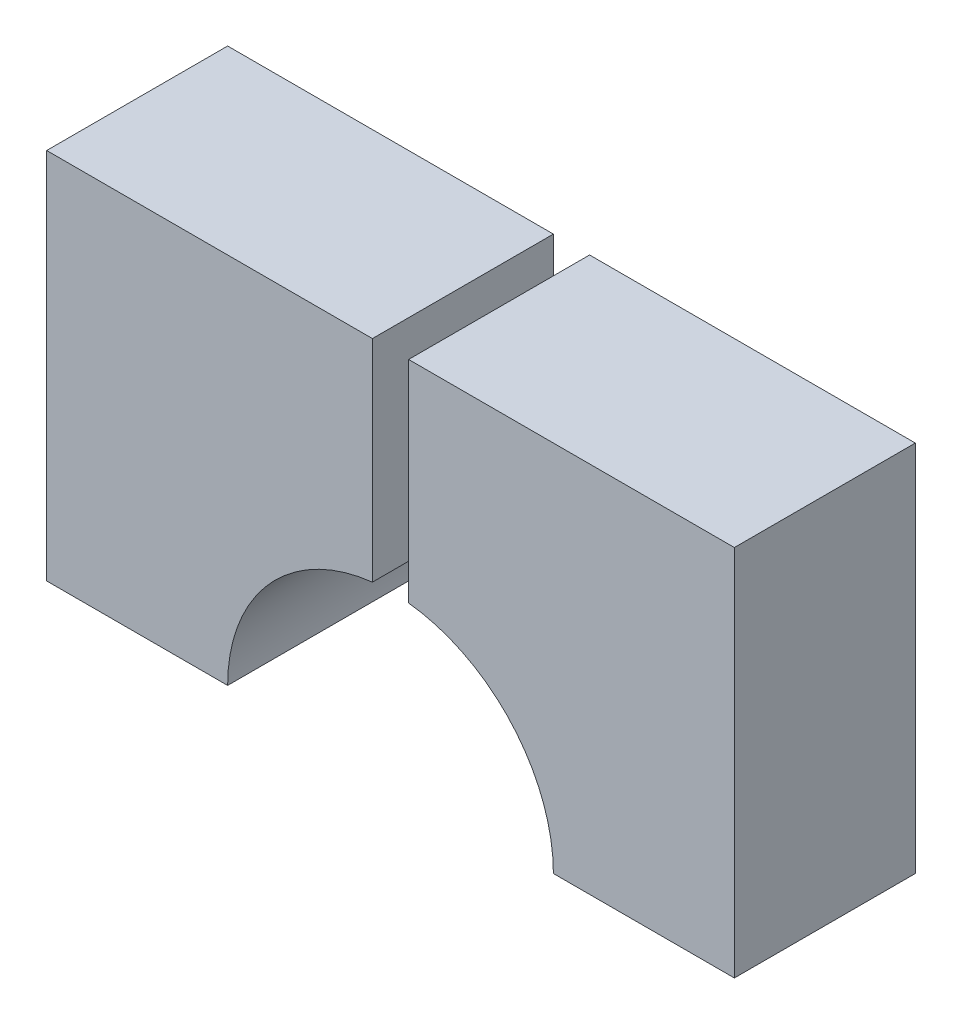
ISO-10303-21;
HEADER;
FILE_DESCRIPTION(('STEP AP214'),'2;1');
FILE_NAME('part.step','',(''),(''),'','','');
FILE_SCHEMA(('AUTOMOTIVE_DESIGN { 1 0 10303 214 1 1 1 1 }'));
ENDSEC;
DATA;
#1=APPLICATION_CONTEXT('core data for automotive mechanical design processes');
#2=APPLICATION_PROTOCOL_DEFINITION('international standard','automotive_design',2000,#1);
#3=PRODUCT_CONTEXT('',#1,'mechanical');
#4=PRODUCT('Part','Part','',(#3));
#5=PRODUCT_RELATED_PRODUCT_CATEGORY('part','',(#4));
#6=PRODUCT_DEFINITION_FORMATION('','',#4);
#7=PRODUCT_DEFINITION_CONTEXT('part definition',#1,'design');
#8=PRODUCT_DEFINITION('design','',#6,#7);
#9=PRODUCT_DEFINITION_SHAPE('','',#8);
#10=(LENGTH_UNIT() NAMED_UNIT(*) SI_UNIT(.MILLI.,.METRE.));
#11=(NAMED_UNIT(*) PLANE_ANGLE_UNIT() SI_UNIT($,.RADIAN.));
#12=(NAMED_UNIT(*) SI_UNIT($,.STERADIAN.) SOLID_ANGLE_UNIT());
#13=UNCERTAINTY_MEASURE_WITH_UNIT(LENGTH_MEASURE(1.E-05),#10,'distance_accuracy_value','');
#14=(GEOMETRIC_REPRESENTATION_CONTEXT(3) GLOBAL_UNCERTAINTY_ASSIGNED_CONTEXT((#13)) GLOBAL_UNIT_ASSIGNED_CONTEXT((#10,
#11,#12)) REPRESENTATION_CONTEXT('',''));
#15=CARTESIAN_POINT('',(0.,0.,0.));
#16=DIRECTION('',(0.,0.,1.));
#17=DIRECTION('',(1.,0.,0.));
#18=AXIS2_PLACEMENT_3D('',#15,#16,#17);
#19=CARTESIAN_POINT('',(-2.0574750877524E-12,-505.650336196322,-130.));
#20=DIRECTION('',(0.,0.,1.));
#21=DIRECTION('',(-1.,0.,0.));
#22=AXIS2_PLACEMENT_3D('',#19,#20,#21);
#23=CYLINDRICAL_SURFACE('',#22,90.);
#24=CARTESIAN_POINT('',(-2.0574750877524E-12,-505.650336196322,-30.));
#25=DIRECTION('',(0.,0.,-1.));
#26=DIRECTION('',(-1.,0.,0.));
#27=AXIS2_PLACEMENT_3D('',#24,#25,#26);
#28=CIRCLE('',#27,90.);
#29=CARTESIAN_POINT('',(-90.0000000000021,-505.650336196322,-30.));
#30=VERTEX_POINT('',#29);
#31=CARTESIAN_POINT('',(-10.0000000000012,-416.20761709633,-30.));
#32=VERTEX_POINT('',#31);
#33=EDGE_CURVE('E120',#30,#32,#28,.T.);
#34=ORIENTED_EDGE('',*,*,#33,.F.);
#35=DIRECTION('',(0.,0.,1.));
#36=VECTOR('',#35,1.);
#37=CARTESIAN_POINT('',(-90.0000000000021,-505.650336196322,-130.));
#38=LINE('',#37,#36);
#39=CARTESIAN_POINT('',(-90.0000000000021,-505.650336196322,-130.));
#40=VERTEX_POINT('',#39);
#41=EDGE_CURVE('E48',#40,#30,#38,.T.);
#42=ORIENTED_EDGE('',*,*,#41,.F.);
#43=CARTESIAN_POINT('',(-2.0574750877524E-12,-505.650336196322,-130.));
#44=DIRECTION('',(0.,0.,-1.));
#45=DIRECTION('',(-1.,0.,0.));
#46=AXIS2_PLACEMENT_3D('',#43,#44,#45);
#47=CIRCLE('',#46,90.);
#48=CARTESIAN_POINT('',(-10.0000000000012,-416.20761709633,-130.));
#49=VERTEX_POINT('',#48);
#50=EDGE_CURVE('E127',#40,#49,#47,.T.);
#51=ORIENTED_EDGE('',*,*,#50,.T.);
#52=DIRECTION('',(0.,0.,1.));
#53=VECTOR('',#52,1.);
#54=CARTESIAN_POINT('',(-10.0000000000012,-416.20761709633,-130.));
#55=LINE('',#54,#53);
#56=EDGE_CURVE('E12',#49,#32,#55,.T.);
#57=ORIENTED_EDGE('',*,*,#56,.T.);
#58=EDGE_LOOP('',(#34,#42,#51,#57));
#59=FACE_BOUND('',#58,.T.);
#60=ADVANCED_FACE('F45',(#59),#23,.F.);
#61=CARTESIAN_POINT('',(-9.99999999999701,0.,-130.));
#62=DIRECTION('',(-1.,0.,0.));
#63=DIRECTION('',(0.,1.,0.));
#64=AXIS2_PLACEMENT_3D('',#61,#62,#63);
#65=PLANE('',#64);
#66=DIRECTION('',(0.,1.,0.));
#67=VECTOR('',#66,1.);
#68=CARTESIAN_POINT('',(-9.99999999999701,0.,-30.));
#69=LINE('',#68,#67);
#70=CARTESIAN_POINT('',(-10.,-299.650336196323,-30.));
#71=VERTEX_POINT('',#70);
#72=EDGE_CURVE('E89',#32,#71,#69,.T.);
#73=ORIENTED_EDGE('',*,*,#72,.F.);
#74=ORIENTED_EDGE('',*,*,#56,.F.);
#75=DIRECTION('',(0.,1.,0.));
#76=VECTOR('',#75,1.);
#77=CARTESIAN_POINT('',(-9.99999999999701,0.,-130.));
#78=LINE('',#77,#76);
#79=CARTESIAN_POINT('',(-10.,-299.650336196323,-130.));
#80=VERTEX_POINT('',#79);
#81=EDGE_CURVE('E63',#49,#80,#78,.T.);
#82=ORIENTED_EDGE('',*,*,#81,.T.);
#83=DIRECTION('',(0.,0.,1.));
#84=VECTOR('',#83,1.);
#85=CARTESIAN_POINT('',(-10.,-299.650336196323,-130.));
#86=LINE('',#85,#84);
#87=EDGE_CURVE('E54',#80,#71,#86,.T.);
#88=ORIENTED_EDGE('',*,*,#87,.T.);
#89=EDGE_LOOP('',(#73,#74,#82,#88));
#90=FACE_BOUND('',#89,.T.);
#91=ADVANCED_FACE('F144',(#90),#65,.F.);
#92=CARTESIAN_POINT('',(0.,-299.650336196323,-130.));
#93=DIRECTION('',(0.,1.,0.));
#94=DIRECTION('',(0.,0.,1.));
#95=AXIS2_PLACEMENT_3D('',#92,#93,#94);
#96=PLANE('',#95);
#97=DIRECTION('',(1.,0.,0.));
#98=VECTOR('',#97,1.);
#99=CARTESIAN_POINT('',(0.,-299.650336196323,-30.));
#100=LINE('',#99,#98);
#101=CARTESIAN_POINT('',(-190.000000000002,-299.650336196323,-30.));
#102=VERTEX_POINT('',#101);
#103=EDGE_CURVE('E83',#102,#71,#100,.T.);
#104=ORIENTED_EDGE('',*,*,#103,.T.);
#105=ORIENTED_EDGE('',*,*,#87,.F.);
#106=DIRECTION('',(1.,0.,0.));
#107=VECTOR('',#106,1.);
#108=CARTESIAN_POINT('',(0.,-299.650336196323,-130.));
#109=LINE('',#108,#107);
#110=CARTESIAN_POINT('',(-190.000000000002,-299.650336196323,-130.));
#111=VERTEX_POINT('',#110);
#112=EDGE_CURVE('E105',#111,#80,#109,.T.);
#113=ORIENTED_EDGE('',*,*,#112,.F.);
#114=DIRECTION('',(0.,0.,1.));
#115=VECTOR('',#114,1.);
#116=CARTESIAN_POINT('',(-190.000000000002,-299.650336196323,-130.));
#117=LINE('',#116,#115);
#118=EDGE_CURVE('E109',#111,#102,#117,.T.);
#119=ORIENTED_EDGE('',*,*,#118,.T.);
#120=EDGE_LOOP('',(#104,#105,#113,#119));
#121=FACE_BOUND('',#120,.T.);
#122=ADVANCED_FACE('F115',(#121),#96,.T.);
#123=CARTESIAN_POINT('',(-190.000000000002,0.,-130.));
#124=DIRECTION('',(-1.,0.,0.));
#125=DIRECTION('',(0.,0.,-1.));
#126=AXIS2_PLACEMENT_3D('',#123,#124,#125);
#127=PLANE('',#126);
#128=DIRECTION('',(0.,1.,0.));
#129=VECTOR('',#128,1.);
#130=CARTESIAN_POINT('',(-190.000000000002,0.,-30.));
#131=LINE('',#130,#129);
#132=CARTESIAN_POINT('',(-190.000000000002,-505.650336196322,-30.));
#133=VERTEX_POINT('',#132);
#134=EDGE_CURVE('E112',#133,#102,#131,.T.);
#135=ORIENTED_EDGE('',*,*,#134,.T.);
#136=ORIENTED_EDGE('',*,*,#118,.F.);
#137=DIRECTION('',(0.,1.,0.));
#138=VECTOR('',#137,1.);
#139=CARTESIAN_POINT('',(-190.000000000002,0.,-130.));
#140=LINE('',#139,#138);
#141=CARTESIAN_POINT('',(-190.000000000002,-505.650336196322,-130.));
#142=VERTEX_POINT('',#141);
#143=EDGE_CURVE('E101',#142,#111,#140,.T.);
#144=ORIENTED_EDGE('',*,*,#143,.F.);
#145=DIRECTION('',(0.,0.,1.));
#146=VECTOR('',#145,1.);
#147=CARTESIAN_POINT('',(-190.000000000002,-505.650336196322,-130.));
#148=LINE('',#147,#146);
#149=EDGE_CURVE('E113',#142,#133,#148,.T.);
#150=ORIENTED_EDGE('',*,*,#149,.T.);
#151=EDGE_LOOP('',(#135,#136,#144,#150));
#152=FACE_BOUND('',#151,.T.);
#153=ADVANCED_FACE('F110',(#152),#127,.T.);
#154=CARTESIAN_POINT('',(-1.47732801488053E-13,-505.650336196322,-130.));
#155=DIRECTION('',(0.,1.,0.));
#156=DIRECTION('',(1.,0.,0.));
#157=AXIS2_PLACEMENT_3D('',#154,#155,#156);
#158=PLANE('',#157);
#159=DIRECTION('',(1.,0.,0.));
#160=VECTOR('',#159,1.);
#161=CARTESIAN_POINT('',(-1.47732801488053E-13,-505.650336196322,-30.));
#162=LINE('',#161,#160);
#163=EDGE_CURVE('E123',#133,#30,#162,.T.);
#164=ORIENTED_EDGE('',*,*,#163,.F.);
#165=ORIENTED_EDGE('',*,*,#149,.F.);
#166=DIRECTION('',(1.,0.,0.));
#167=VECTOR('',#166,1.);
#168=CARTESIAN_POINT('',(-1.47732801488053E-13,-505.650336196322,-130.));
#169=LINE('',#168,#167);
#170=EDGE_CURVE('E97',#142,#40,#169,.T.);
#171=ORIENTED_EDGE('',*,*,#170,.T.);
#172=ORIENTED_EDGE('',*,*,#41,.T.);
#173=EDGE_LOOP('',(#164,#165,#171,#172));
#174=FACE_BOUND('',#173,.T.);
#175=ADVANCED_FACE('F131',(#174),#158,.F.);
#176=CARTESIAN_POINT('',(0.,0.,-130.));
#177=DIRECTION('',(0.,0.,1.));
#178=DIRECTION('',(-1.,0.,0.));
#179=AXIS2_PLACEMENT_3D('',#176,#177,#178);
#180=PLANE('',#179);
#181=ORIENTED_EDGE('',*,*,#50,.F.);
#182=ORIENTED_EDGE('',*,*,#170,.F.);
#183=ORIENTED_EDGE('',*,*,#143,.T.);
#184=ORIENTED_EDGE('',*,*,#112,.T.);
#185=ORIENTED_EDGE('',*,*,#81,.F.);
#186=EDGE_LOOP('',(#181,#182,#183,#184,#185));
#187=FACE_BOUND('',#186,.T.);
#188=ADVANCED_FACE('F103',(#187),#180,.F.);
#189=CARTESIAN_POINT('',(0.,0.,-30.));
#190=DIRECTION('',(0.,0.,1.));
#191=DIRECTION('',(-1.,0.,0.));
#192=AXIS2_PLACEMENT_3D('',#189,#190,#191);
#193=PLANE('',#192);
#194=ORIENTED_EDGE('',*,*,#33,.T.);
#195=ORIENTED_EDGE('',*,*,#72,.T.);
#196=ORIENTED_EDGE('',*,*,#103,.F.);
#197=ORIENTED_EDGE('',*,*,#134,.F.);
#198=ORIENTED_EDGE('',*,*,#163,.T.);
#199=EDGE_LOOP('',(#194,#195,#196,#197,#198));
#200=FACE_BOUND('',#199,.T.);
#201=ADVANCED_FACE('F135',(#200),#193,.T.);
#202=CLOSED_SHELL('',(#60,#91,#122,#153,#175,#188,#201));
#203=MANIFOLD_SOLID_BREP('B2',#202);
#204=CARTESIAN_POINT('',(2.0574750877524E-12,-505.650336196322,-130.));
#205=DIRECTION('',(0.,0.,1.));
#206=DIRECTION('',(1.,0.,0.));
#207=AXIS2_PLACEMENT_3D('',#204,#205,#206);
#208=CYLINDRICAL_SURFACE('',#207,90.);
#209=CARTESIAN_POINT('',(2.0574750877524E-12,-505.650336196322,-30.));
#210=DIRECTION('',(0.,0.,1.));
#211=DIRECTION('',(1.,0.,0.));
#212=AXIS2_PLACEMENT_3D('',#209,#210,#211);
#213=CIRCLE('',#212,90.);
#214=CARTESIAN_POINT('',(90.0000000000021,-505.650336196322,-30.));
#215=VERTEX_POINT('',#214);
#216=CARTESIAN_POINT('',(10.0000000000012,-416.20761709633,-30.));
#217=VERTEX_POINT('',#216);
#218=EDGE_CURVE('E279',#215,#217,#213,.T.);
#219=ORIENTED_EDGE('',*,*,#218,.T.);
#220=DIRECTION('',(0.,0.,1.));
#221=VECTOR('',#220,1.);
#222=CARTESIAN_POINT('',(10.0000000000012,-416.20761709633,-130.));
#223=LINE('',#222,#221);
#224=CARTESIAN_POINT('',(10.0000000000012,-416.20761709633,-130.));
#225=VERTEX_POINT('',#224);
#226=EDGE_CURVE('E43',#225,#217,#223,.T.);
#227=ORIENTED_EDGE('',*,*,#226,.F.);
#228=CARTESIAN_POINT('',(2.0574750877524E-12,-505.650336196322,-130.));
#229=DIRECTION('',(0.,0.,1.));
#230=DIRECTION('',(1.,0.,0.));
#231=AXIS2_PLACEMENT_3D('',#228,#229,#230);
#232=CIRCLE('',#231,90.);
#233=CARTESIAN_POINT('',(90.0000000000021,-505.650336196322,-130.));
#234=VERTEX_POINT('',#233);
#235=EDGE_CURVE('E274',#234,#225,#232,.T.);
#236=ORIENTED_EDGE('',*,*,#235,.F.);
#237=DIRECTION('',(0.,0.,1.));
#238=VECTOR('',#237,1.);
#239=CARTESIAN_POINT('',(90.0000000000021,-505.650336196322,-130.));
#240=LINE('',#239,#238);
#241=EDGE_CURVE('E207',#234,#215,#240,.T.);
#242=ORIENTED_EDGE('',*,*,#241,.T.);
#243=EDGE_LOOP('',(#219,#227,#236,#242));
#244=FACE_BOUND('',#243,.T.);
#245=ADVANCED_FACE('F204',(#244),#208,.F.);
#246=CARTESIAN_POINT('',(9.99999999999701,0.,-130.));
#247=DIRECTION('',(1.,0.,0.));
#248=DIRECTION('',(0.,1.,0.));
#249=AXIS2_PLACEMENT_3D('',#246,#247,#248);
#250=PLANE('',#249);
#251=DIRECTION('',(0.,1.,0.));
#252=VECTOR('',#251,1.);
#253=CARTESIAN_POINT('',(9.99999999999701,0.,-30.));
#254=LINE('',#253,#252);
#255=CARTESIAN_POINT('',(10.,-299.650336196323,-30.));
#256=VERTEX_POINT('',#255);
#257=EDGE_CURVE('E246',#217,#256,#254,.T.);
#258=ORIENTED_EDGE('',*,*,#257,.T.);
#259=DIRECTION('',(0.,0.,1.));
#260=VECTOR('',#259,1.);
#261=CARTESIAN_POINT('',(10.,-299.650336196323,-130.));
#262=LINE('',#261,#260);
#263=CARTESIAN_POINT('',(10.,-299.650336196323,-130.));
#264=VERTEX_POINT('',#263);
#265=EDGE_CURVE('E213',#264,#256,#262,.T.);
#266=ORIENTED_EDGE('',*,*,#265,.F.);
#267=DIRECTION('',(0.,1.,0.));
#268=VECTOR('',#267,1.);
#269=CARTESIAN_POINT('',(9.99999999999701,0.,-130.));
#270=LINE('',#269,#268);
#271=EDGE_CURVE('E221',#225,#264,#270,.T.);
#272=ORIENTED_EDGE('',*,*,#271,.F.);
#273=ORIENTED_EDGE('',*,*,#226,.T.);
#274=EDGE_LOOP('',(#258,#266,#272,#273));
#275=FACE_BOUND('',#274,.T.);
#276=ADVANCED_FACE('F304',(#275),#250,.F.);
#277=CARTESIAN_POINT('',(0.,-299.650336196323,-130.));
#278=DIRECTION('',(0.,1.,0.));
#279=DIRECTION('',(0.,0.,1.));
#280=AXIS2_PLACEMENT_3D('',#277,#278,#279);
#281=PLANE('',#280);
#282=DIRECTION('',(-1.,0.,0.));
#283=VECTOR('',#282,1.);
#284=CARTESIAN_POINT('',(0.,-299.650336196323,-30.));
#285=LINE('',#284,#283);
#286=CARTESIAN_POINT('',(190.000000000002,-299.650336196323,-30.));
#287=VERTEX_POINT('',#286);
#288=EDGE_CURVE('E262',#287,#256,#285,.T.);
#289=ORIENTED_EDGE('',*,*,#288,.F.);
#290=DIRECTION('',(0.,0.,1.));
#291=VECTOR('',#290,1.);
#292=CARTESIAN_POINT('',(190.000000000002,-299.650336196323,-130.));
#293=LINE('',#292,#291);
#294=CARTESIAN_POINT('',(190.000000000002,-299.650336196323,-130.));
#295=VERTEX_POINT('',#294);
#296=EDGE_CURVE('E258',#295,#287,#293,.T.);
#297=ORIENTED_EDGE('',*,*,#296,.F.);
#298=DIRECTION('',(-1.,0.,0.));
#299=VECTOR('',#298,1.);
#300=CARTESIAN_POINT('',(0.,-299.650336196323,-130.));
#301=LINE('',#300,#299);
#302=EDGE_CURVE('E261',#295,#264,#301,.T.);
#303=ORIENTED_EDGE('',*,*,#302,.T.);
#304=ORIENTED_EDGE('',*,*,#265,.T.);
#305=EDGE_LOOP('',(#289,#297,#303,#304));
#306=FACE_BOUND('',#305,.T.);
#307=ADVANCED_FACE('F260',(#306),#281,.T.);
#308=CARTESIAN_POINT('',(190.000000000002,0.,-130.));
#309=DIRECTION('',(1.,0.,0.));
#310=DIRECTION('',(0.,0.,-1.));
#311=AXIS2_PLACEMENT_3D('',#308,#309,#310);
#312=PLANE('',#311);
#313=DIRECTION('',(0.,1.,0.));
#314=VECTOR('',#313,1.);
#315=CARTESIAN_POINT('',(190.000000000002,0.,-30.));
#316=LINE('',#315,#314);
#317=CARTESIAN_POINT('',(190.000000000002,-505.650336196322,-30.));
#318=VERTEX_POINT('',#317);
#319=EDGE_CURVE('E284',#318,#287,#316,.T.);
#320=ORIENTED_EDGE('',*,*,#319,.F.);
#321=DIRECTION('',(0.,0.,1.));
#322=VECTOR('',#321,1.);
#323=CARTESIAN_POINT('',(190.000000000002,-505.650336196322,-130.));
#324=LINE('',#323,#322);
#325=CARTESIAN_POINT('',(190.000000000002,-505.650336196322,-130.));
#326=VERTEX_POINT('',#325);
#327=EDGE_CURVE('E267',#326,#318,#324,.T.);
#328=ORIENTED_EDGE('',*,*,#327,.F.);
#329=DIRECTION('',(0.,1.,0.));
#330=VECTOR('',#329,1.);
#331=CARTESIAN_POINT('',(190.000000000002,0.,-130.));
#332=LINE('',#331,#330);
#333=EDGE_CURVE('E270',#326,#295,#332,.T.);
#334=ORIENTED_EDGE('',*,*,#333,.T.);
#335=ORIENTED_EDGE('',*,*,#296,.T.);
#336=EDGE_LOOP('',(#320,#328,#334,#335));
#337=FACE_BOUND('',#336,.T.);
#338=ADVANCED_FACE('F272',(#337),#312,.T.);
#339=CARTESIAN_POINT('',(1.47732801488053E-13,-505.650336196322,-130.));
#340=DIRECTION('',(0.,1.,0.));
#341=DIRECTION('',(-1.,0.,0.));
#342=AXIS2_PLACEMENT_3D('',#339,#340,#341);
#343=PLANE('',#342);
#344=DIRECTION('',(-1.,0.,0.));
#345=VECTOR('',#344,1.);
#346=CARTESIAN_POINT('',(1.47732801488053E-13,-505.650336196322,-30.));
#347=LINE('',#346,#345);
#348=EDGE_CURVE('E282',#318,#215,#347,.T.);
#349=ORIENTED_EDGE('',*,*,#348,.T.);
#350=ORIENTED_EDGE('',*,*,#241,.F.);
#351=DIRECTION('',(-1.,0.,0.));
#352=VECTOR('',#351,1.);
#353=CARTESIAN_POINT('',(1.47732801488053E-13,-505.650336196322,-130.));
#354=LINE('',#353,#352);
#355=EDGE_CURVE('E253',#326,#234,#354,.T.);
#356=ORIENTED_EDGE('',*,*,#355,.F.);
#357=ORIENTED_EDGE('',*,*,#327,.T.);
#358=EDGE_LOOP('',(#349,#350,#356,#357));
#359=FACE_BOUND('',#358,.T.);
#360=ADVANCED_FACE('F295',(#359),#343,.F.);
#361=CARTESIAN_POINT('',(0.,0.,-130.));
#362=DIRECTION('',(0.,0.,1.));
#363=DIRECTION('',(1.,0.,0.));
#364=AXIS2_PLACEMENT_3D('',#361,#362,#363);
#365=PLANE('',#364);
#366=ORIENTED_EDGE('',*,*,#235,.T.);
#367=ORIENTED_EDGE('',*,*,#271,.T.);
#368=ORIENTED_EDGE('',*,*,#302,.F.);
#369=ORIENTED_EDGE('',*,*,#333,.F.);
#370=ORIENTED_EDGE('',*,*,#355,.T.);
#371=EDGE_LOOP('',(#366,#367,#368,#369,#370));
#372=FACE_BOUND('',#371,.T.);
#373=ADVANCED_FACE('F269',(#372),#365,.F.);
#374=CARTESIAN_POINT('',(0.,0.,-30.));
#375=DIRECTION('',(0.,0.,1.));
#376=DIRECTION('',(1.,0.,0.));
#377=AXIS2_PLACEMENT_3D('',#374,#375,#376);
#378=PLANE('',#377);
#379=ORIENTED_EDGE('',*,*,#218,.F.);
#380=ORIENTED_EDGE('',*,*,#348,.F.);
#381=ORIENTED_EDGE('',*,*,#319,.T.);
#382=ORIENTED_EDGE('',*,*,#288,.T.);
#383=ORIENTED_EDGE('',*,*,#257,.F.);
#384=EDGE_LOOP('',(#379,#380,#381,#382,#383));
#385=FACE_BOUND('',#384,.T.);
#386=ADVANCED_FACE('F294',(#385),#378,.T.);
#387=CLOSED_SHELL('',(#245,#276,#307,#338,#360,#373,#386));
#388=MANIFOLD_SOLID_BREP('B6',#387);
#389=ADVANCED_BREP_SHAPE_REPRESENTATION('',(#18,#203,#388),#14);
#390=SHAPE_DEFINITION_REPRESENTATION(#9,#389);
ENDSEC;
END-ISO-10303-21;
